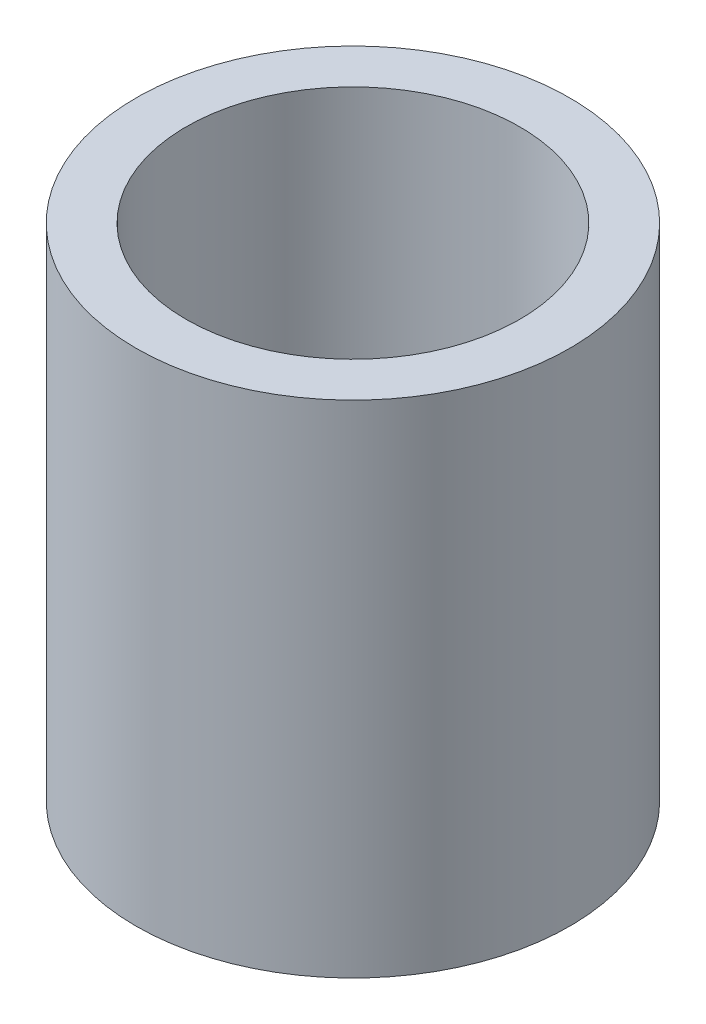
ISO-10303-21;
HEADER;
FILE_DESCRIPTION(('STEP AP214'),'2;1');
FILE_NAME('part.step','',(''),(''),'','','');
FILE_SCHEMA(('AUTOMOTIVE_DESIGN { 1 0 10303 214 1 1 1 1 }'));
ENDSEC;
DATA;
#1=APPLICATION_CONTEXT('core data for automotive mechanical design processes');
#2=APPLICATION_PROTOCOL_DEFINITION('international standard','automotive_design',2000,#1);
#3=PRODUCT_CONTEXT('',#1,'mechanical');
#4=PRODUCT('Part','Part','',(#3));
#5=PRODUCT_RELATED_PRODUCT_CATEGORY('part','',(#4));
#6=PRODUCT_DEFINITION_FORMATION('','',#4);
#7=PRODUCT_DEFINITION_CONTEXT('part definition',#1,'design');
#8=PRODUCT_DEFINITION('design','',#6,#7);
#9=PRODUCT_DEFINITION_SHAPE('','',#8);
#10=(LENGTH_UNIT() NAMED_UNIT(*) SI_UNIT(.MILLI.,.METRE.));
#11=(NAMED_UNIT(*) PLANE_ANGLE_UNIT() SI_UNIT($,.RADIAN.));
#12=(NAMED_UNIT(*) SI_UNIT($,.STERADIAN.) SOLID_ANGLE_UNIT());
#13=UNCERTAINTY_MEASURE_WITH_UNIT(LENGTH_MEASURE(1.E-05),#10,'distance_accuracy_value','');
#14=(GEOMETRIC_REPRESENTATION_CONTEXT(3) GLOBAL_UNCERTAINTY_ASSIGNED_CONTEXT((#13)) GLOBAL_UNIT_ASSIGNED_CONTEXT((#10,
#11,#12)) REPRESENTATION_CONTEXT('',''));
#15=CARTESIAN_POINT('',(0.,0.,0.));
#16=DIRECTION('',(0.,0.,1.));
#17=DIRECTION('',(1.,0.,0.));
#18=AXIS2_PLACEMENT_3D('',#15,#16,#17);
#19=CARTESIAN_POINT('',(0.,30.,0.));
#20=DIRECTION('',(0.,1.,0.));
#21=DIRECTION('',(0.,0.,1.));
#22=AXIS2_PLACEMENT_3D('',#19,#20,#21);
#23=PLANE('',#22);
#24=CARTESIAN_POINT('',(0.,30.,0.));
#25=DIRECTION('',(0.,1.,0.));
#26=DIRECTION('',(0.,0.,1.));
#27=AXIS2_PLACEMENT_3D('',#24,#25,#26);
#28=CIRCLE('',#27,13.);
#29=CARTESIAN_POINT('',(0.,30.,13.));
#30=VERTEX_POINT('',#29);
#31=EDGE_CURVE('E10',#30,#30,#28,.T.);
#32=ORIENTED_EDGE('',*,*,#31,.T.);
#33=EDGE_LOOP('',(#32));
#34=FACE_BOUND('',#33,.T.);
#35=CARTESIAN_POINT('',(0.,30.,0.));
#36=DIRECTION('',(0.,1.,0.));
#37=DIRECTION('',(0.,0.,1.));
#38=AXIS2_PLACEMENT_3D('',#35,#36,#37);
#39=CIRCLE('',#38,10.);
#40=CARTESIAN_POINT('',(0.,30.,10.));
#41=VERTEX_POINT('',#40);
#42=EDGE_CURVE('E46',#41,#41,#39,.T.);
#43=ORIENTED_EDGE('',*,*,#42,.F.);
#44=EDGE_LOOP('',(#43));
#45=FACE_BOUND('',#44,.T.);
#46=ADVANCED_FACE('F35',(#34,#45),#23,.T.);
#47=CARTESIAN_POINT('',(0.,0.,0.));
#48=DIRECTION('',(0.,1.,0.));
#49=DIRECTION('',(0.,0.,1.));
#50=AXIS2_PLACEMENT_3D('',#47,#48,#49);
#51=PLANE('',#50);
#52=CARTESIAN_POINT('',(0.,0.,0.));
#53=DIRECTION('',(0.,1.,0.));
#54=DIRECTION('',(0.,0.,1.));
#55=AXIS2_PLACEMENT_3D('',#52,#53,#54);
#56=CIRCLE('',#55,13.);
#57=CARTESIAN_POINT('',(0.,0.,13.));
#58=VERTEX_POINT('',#57);
#59=EDGE_CURVE('E39',#58,#58,#56,.T.);
#60=ORIENTED_EDGE('',*,*,#59,.F.);
#61=EDGE_LOOP('',(#60));
#62=FACE_BOUND('',#61,.T.);
#63=CARTESIAN_POINT('',(0.,0.,0.));
#64=DIRECTION('',(0.,1.,0.));
#65=DIRECTION('',(0.,0.,1.));
#66=AXIS2_PLACEMENT_3D('',#63,#64,#65);
#67=CIRCLE('',#66,10.);
#68=CARTESIAN_POINT('',(0.,0.,10.));
#69=VERTEX_POINT('',#68);
#70=EDGE_CURVE('E48',#69,#69,#67,.T.);
#71=ORIENTED_EDGE('',*,*,#70,.T.);
#72=EDGE_LOOP('',(#71));
#73=FACE_BOUND('',#72,.T.);
#74=ADVANCED_FACE('F58',(#62,#73),#51,.F.);
#75=CARTESIAN_POINT('',(0.,30.,0.));
#76=DIRECTION('',(0.,-1.,0.));
#77=DIRECTION('',(0.,0.,-1.));
#78=AXIS2_PLACEMENT_3D('',#75,#76,#77);
#79=CYLINDRICAL_SURFACE('',#78,13.);
#80=ORIENTED_EDGE('',*,*,#31,.F.);
#81=EDGE_LOOP('',(#80));
#82=FACE_BOUND('',#81,.T.);
#83=ORIENTED_EDGE('',*,*,#59,.T.);
#84=EDGE_LOOP('',(#83));
#85=FACE_BOUND('',#84,.T.);
#86=ADVANCED_FACE('F37',(#82,#85),#79,.T.);
#87=CARTESIAN_POINT('',(0.,30.,0.));
#88=DIRECTION('',(0.,-1.,0.));
#89=DIRECTION('',(0.,0.,-1.));
#90=AXIS2_PLACEMENT_3D('',#87,#88,#89);
#91=CYLINDRICAL_SURFACE('',#90,10.);
#92=ORIENTED_EDGE('',*,*,#42,.T.);
#93=EDGE_LOOP('',(#92));
#94=FACE_BOUND('',#93,.T.);
#95=ORIENTED_EDGE('',*,*,#70,.F.);
#96=EDGE_LOOP('',(#95));
#97=FACE_BOUND('',#96,.T.);
#98=ADVANCED_FACE('F54',(#94,#97),#91,.F.);
#99=CLOSED_SHELL('',(#46,#74,#86,#98));
#100=MANIFOLD_SOLID_BREP('B2',#99);
#101=ADVANCED_BREP_SHAPE_REPRESENTATION('',(#18,#100),#14);
#102=SHAPE_DEFINITION_REPRESENTATION(#9,#101);
ENDSEC;
END-ISO-10303-21;
